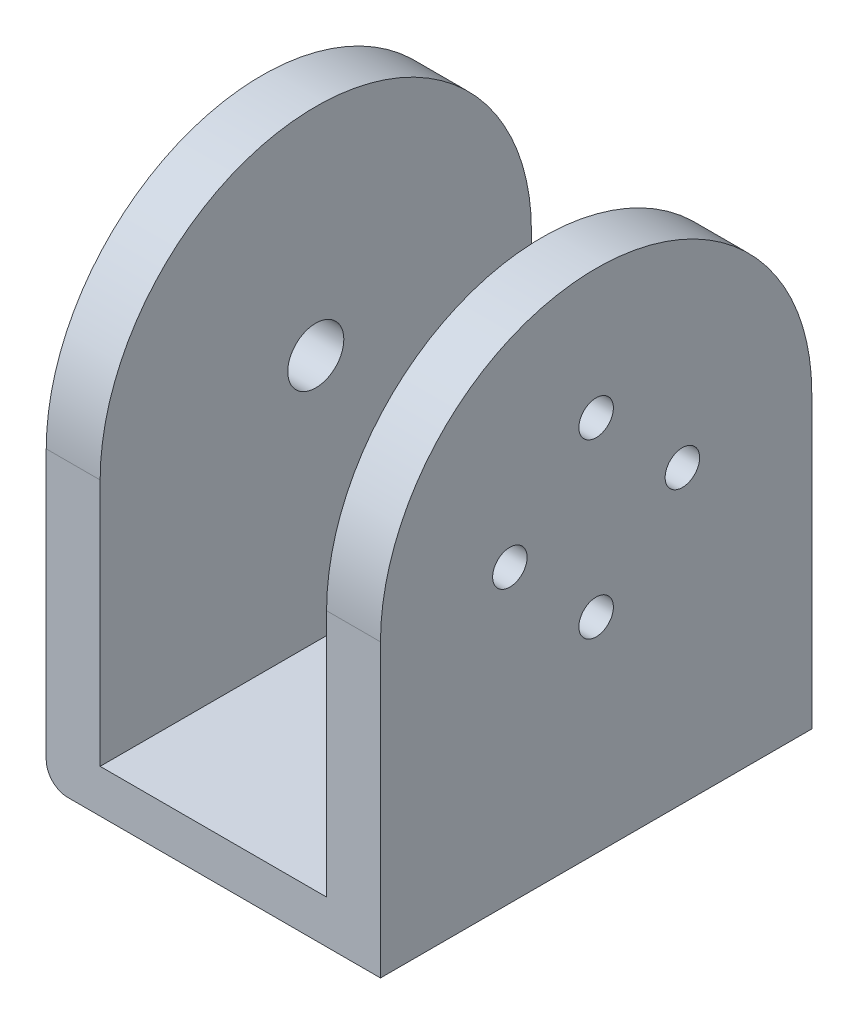
ISO-10303-21;
HEADER;
FILE_DESCRIPTION(('STEP AP214'),'2;1');
FILE_NAME('part.step','',(''),(''),'','','');
FILE_SCHEMA(('AUTOMOTIVE_DESIGN { 1 0 10303 214 1 1 1 1 }'));
ENDSEC;
DATA;
#1=APPLICATION_CONTEXT('core data for automotive mechanical design processes');
#2=APPLICATION_PROTOCOL_DEFINITION('international standard','automotive_design',2000,#1);
#3=PRODUCT_CONTEXT('',#1,'mechanical');
#4=PRODUCT('Part','Part','',(#3));
#5=PRODUCT_RELATED_PRODUCT_CATEGORY('part','',(#4));
#6=PRODUCT_DEFINITION_FORMATION('','',#4);
#7=PRODUCT_DEFINITION_CONTEXT('part definition',#1,'design');
#8=PRODUCT_DEFINITION('design','',#6,#7);
#9=PRODUCT_DEFINITION_SHAPE('','',#8);
#10=(LENGTH_UNIT() NAMED_UNIT(*) SI_UNIT(.MILLI.,.METRE.));
#11=(NAMED_UNIT(*) PLANE_ANGLE_UNIT() SI_UNIT($,.RADIAN.));
#12=(NAMED_UNIT(*) SI_UNIT($,.STERADIAN.) SOLID_ANGLE_UNIT());
#13=UNCERTAINTY_MEASURE_WITH_UNIT(LENGTH_MEASURE(1.E-05),#10,'distance_accuracy_value','');
#14=(GEOMETRIC_REPRESENTATION_CONTEXT(3) GLOBAL_UNCERTAINTY_ASSIGNED_CONTEXT((#13)) GLOBAL_UNIT_ASSIGNED_CONTEXT((#10,
#11,#12)) REPRESENTATION_CONTEXT('',''));
#15=CARTESIAN_POINT('',(0.,0.,0.));
#16=DIRECTION('',(0.,0.,1.));
#17=DIRECTION('',(1.,0.,0.));
#18=AXIS2_PLACEMENT_3D('',#15,#16,#17);
#19=CARTESIAN_POINT('',(3.,27.,0.));
#20=DIRECTION('',(1.,0.,0.));
#21=DIRECTION('',(0.,0.,-1.));
#22=AXIS2_PLACEMENT_3D('',#19,#20,#21);
#23=CYLINDRICAL_SURFACE('',#22,20.);
#24=DIRECTION('',(1.,0.,0.));
#25=VECTOR('',#24,1.);
#26=CARTESIAN_POINT('',(3.,27.,20.));
#27=LINE('',#26,#25);
#28=CARTESIAN_POINT('',(3.,27.,20.));
#29=VERTEX_POINT('',#28);
#30=CARTESIAN_POINT('',(8.00000000000001,27.,20.));
#31=VERTEX_POINT('',#30);
#32=EDGE_CURVE('E177',#29,#31,#27,.T.);
#33=ORIENTED_EDGE('',*,*,#32,.T.);
#34=CARTESIAN_POINT('',(8.,27.,0.));
#35=DIRECTION('',(1.,0.,0.));
#36=DIRECTION('',(0.,0.,-1.));
#37=AXIS2_PLACEMENT_3D('',#34,#35,#36);
#38=CIRCLE('',#37,20.);
#39=CARTESIAN_POINT('',(8.,27.,-20.));
#40=VERTEX_POINT('',#39);
#41=EDGE_CURVE('E137',#40,#31,#38,.T.);
#42=ORIENTED_EDGE('',*,*,#41,.F.);
#43=DIRECTION('',(1.,0.,0.));
#44=VECTOR('',#43,1.);
#45=CARTESIAN_POINT('',(3.,27.,-20.));
#46=LINE('',#45,#44);
#47=CARTESIAN_POINT('',(3.,27.,-20.));
#48=VERTEX_POINT('',#47);
#49=EDGE_CURVE('E167',#48,#40,#46,.T.);
#50=ORIENTED_EDGE('',*,*,#49,.F.);
#51=CARTESIAN_POINT('',(3.,27.,0.));
#52=DIRECTION('',(1.,0.,0.));
#53=DIRECTION('',(0.,0.,-1.));
#54=AXIS2_PLACEMENT_3D('',#51,#52,#53);
#55=CIRCLE('',#54,20.);
#56=EDGE_CURVE('E180',#48,#29,#55,.T.);
#57=ORIENTED_EDGE('',*,*,#56,.T.);
#58=EDGE_LOOP('',(#33,#42,#50,#57));
#59=FACE_BOUND('',#58,.T.);
#60=ADVANCED_FACE('F60',(#59),#23,.T.);
#61=CARTESIAN_POINT('',(-2.,19.,0.));
#62=DIRECTION('',(1.,0.,0.));
#63=DIRECTION('',(0.,0.,-1.));
#64=AXIS2_PLACEMENT_3D('',#61,#62,#63);
#65=CYLINDRICAL_SURFACE('',#64,1.6);
#66=CARTESIAN_POINT('',(3.,19.,0.));
#67=DIRECTION('',(1.,0.,0.));
#68=DIRECTION('',(0.,0.,-1.));
#69=AXIS2_PLACEMENT_3D('',#66,#67,#68);
#70=CIRCLE('',#69,1.6);
#71=CARTESIAN_POINT('',(3.,19.,-1.60000000000008));
#72=VERTEX_POINT('',#71);
#73=EDGE_CURVE('E205',#72,#72,#70,.T.);
#74=ORIENTED_EDGE('',*,*,#73,.F.);
#75=EDGE_LOOP('',(#74));
#76=FACE_BOUND('',#75,.T.);
#77=CARTESIAN_POINT('',(8.,19.,0.));
#78=DIRECTION('',(1.,0.,0.));
#79=DIRECTION('',(0.,0.,-1.));
#80=AXIS2_PLACEMENT_3D('',#77,#78,#79);
#81=CIRCLE('',#80,1.6);
#82=CARTESIAN_POINT('',(8.,19.,-1.60000000000008));
#83=VERTEX_POINT('',#82);
#84=EDGE_CURVE('E221',#83,#83,#81,.F.);
#85=ORIENTED_EDGE('',*,*,#84,.F.);
#86=EDGE_LOOP('',(#85));
#87=FACE_BOUND('',#86,.T.);
#88=ADVANCED_FACE('F259',(#76,#87),#65,.F.);
#89=CARTESIAN_POINT('',(-2.,26.9999999999999,8.));
#90=DIRECTION('',(1.,0.,0.));
#91=DIRECTION('',(0.,0.,-1.));
#92=AXIS2_PLACEMENT_3D('',#89,#90,#91);
#93=CYLINDRICAL_SURFACE('',#92,1.6);
#94=CARTESIAN_POINT('',(3.,26.9999999999999,8.));
#95=DIRECTION('',(1.,0.,0.));
#96=DIRECTION('',(0.,0.,-1.));
#97=AXIS2_PLACEMENT_3D('',#94,#95,#96);
#98=CIRCLE('',#97,1.6);
#99=CARTESIAN_POINT('',(3.,26.9999999999999,6.4));
#100=VERTEX_POINT('',#99);
#101=EDGE_CURVE('E208',#100,#100,#98,.T.);
#102=ORIENTED_EDGE('',*,*,#101,.F.);
#103=EDGE_LOOP('',(#102));
#104=FACE_BOUND('',#103,.T.);
#105=CARTESIAN_POINT('',(8.00000000000001,26.9999999999999,8.));
#106=DIRECTION('',(1.,0.,0.));
#107=DIRECTION('',(0.,0.,-1.));
#108=AXIS2_PLACEMENT_3D('',#105,#106,#107);
#109=CIRCLE('',#108,1.6);
#110=CARTESIAN_POINT('',(8.00000000000001,26.9999999999999,6.4));
#111=VERTEX_POINT('',#110);
#112=EDGE_CURVE('E226',#111,#111,#109,.F.);
#113=ORIENTED_EDGE('',*,*,#112,.F.);
#114=EDGE_LOOP('',(#113));
#115=FACE_BOUND('',#114,.T.);
#116=ADVANCED_FACE('F266',(#104,#115),#93,.F.);
#117=CARTESIAN_POINT('',(-2.,35.,0.));
#118=DIRECTION('',(1.,0.,0.));
#119=DIRECTION('',(0.,0.,-1.));
#120=AXIS2_PLACEMENT_3D('',#117,#118,#119);
#121=CYLINDRICAL_SURFACE('',#120,1.6);
#122=CARTESIAN_POINT('',(3.,35.,0.));
#123=DIRECTION('',(1.,0.,0.));
#124=DIRECTION('',(0.,0.,-1.));
#125=AXIS2_PLACEMENT_3D('',#122,#123,#124);
#126=CIRCLE('',#125,1.6);
#127=CARTESIAN_POINT('',(3.,35.,-1.59999999999997));
#128=VERTEX_POINT('',#127);
#129=EDGE_CURVE('E212',#128,#128,#126,.T.);
#130=ORIENTED_EDGE('',*,*,#129,.F.);
#131=EDGE_LOOP('',(#130));
#132=FACE_BOUND('',#131,.T.);
#133=CARTESIAN_POINT('',(8.,35.,0.));
#134=DIRECTION('',(1.,0.,0.));
#135=DIRECTION('',(0.,0.,-1.));
#136=AXIS2_PLACEMENT_3D('',#133,#134,#135);
#137=CIRCLE('',#136,1.6);
#138=CARTESIAN_POINT('',(8.,35.,-1.59999999999997));
#139=VERTEX_POINT('',#138);
#140=EDGE_CURVE('E445',#139,#139,#137,.F.);
#141=ORIENTED_EDGE('',*,*,#140,.F.);
#142=EDGE_LOOP('',(#141));
#143=FACE_BOUND('',#142,.T.);
#144=ADVANCED_FACE('F284',(#132,#143),#121,.F.);
#145=CARTESIAN_POINT('',(-2.,27.,-8.));
#146=DIRECTION('',(1.,0.,0.));
#147=DIRECTION('',(0.,0.,-1.));
#148=AXIS2_PLACEMENT_3D('',#145,#146,#147);
#149=CYLINDRICAL_SURFACE('',#148,1.6);
#150=CARTESIAN_POINT('',(3.,27.,-8.));
#151=DIRECTION('',(1.,0.,0.));
#152=DIRECTION('',(0.,0.,-1.));
#153=AXIS2_PLACEMENT_3D('',#150,#151,#152);
#154=CIRCLE('',#153,1.6);
#155=CARTESIAN_POINT('',(3.,27.,-9.6));
#156=VERTEX_POINT('',#155);
#157=EDGE_CURVE('E198',#156,#156,#154,.T.);
#158=ORIENTED_EDGE('',*,*,#157,.F.);
#159=EDGE_LOOP('',(#158));
#160=FACE_BOUND('',#159,.T.);
#161=CARTESIAN_POINT('',(8.,27.,-8.));
#162=DIRECTION('',(1.,0.,0.));
#163=DIRECTION('',(0.,0.,-1.));
#164=AXIS2_PLACEMENT_3D('',#161,#162,#163);
#165=CIRCLE('',#164,1.6);
#166=CARTESIAN_POINT('',(8.,27.,-9.6));
#167=VERTEX_POINT('',#166);
#168=EDGE_CURVE('E64',#167,#167,#165,.F.);
#169=ORIENTED_EDGE('',*,*,#168,.F.);
#170=EDGE_LOOP('',(#169));
#171=FACE_BOUND('',#170,.T.);
#172=ADVANCED_FACE('F288',(#160,#171),#149,.F.);
#173=CARTESIAN_POINT('',(-23.,4.,-20.));
#174=DIRECTION('',(1.,0.,0.));
#175=DIRECTION('',(0.,0.,-1.));
#176=AXIS2_PLACEMENT_3D('',#173,#174,#175);
#177=PLANE('',#176);
#178=CARTESIAN_POINT('',(-23.,27.,0.));
#179=DIRECTION('',(-1.,0.,0.));
#180=DIRECTION('',(0.,0.,1.));
#181=AXIS2_PLACEMENT_3D('',#178,#179,#180);
#182=CIRCLE('',#181,2.6);
#183=CARTESIAN_POINT('',(-23.,27.,2.60000000000001));
#184=VERTEX_POINT('',#183);
#185=EDGE_CURVE('E217',#184,#184,#182,.T.);
#186=ORIENTED_EDGE('',*,*,#185,.F.);
#187=EDGE_LOOP('',(#186));
#188=FACE_BOUND('',#187,.T.);
#189=CARTESIAN_POINT('',(-23.,27.,0.));
#190=DIRECTION('',(-1.,0.,0.));
#191=DIRECTION('',(0.,0.,1.));
#192=AXIS2_PLACEMENT_3D('',#189,#190,#191);
#193=CIRCLE('',#192,20.);
#194=CARTESIAN_POINT('',(-23.,27.,20.));
#195=VERTEX_POINT('',#194);
#196=CARTESIAN_POINT('',(-23.,27.,-20.));
#197=VERTEX_POINT('',#196);
#198=EDGE_CURVE('E195',#195,#197,#193,.T.);
#199=ORIENTED_EDGE('',*,*,#198,.T.);
#200=DIRECTION('',(0.,-1.,0.));
#201=VECTOR('',#200,1.);
#202=CARTESIAN_POINT('',(-23.,4.,-20.));
#203=LINE('',#202,#201);
#204=CARTESIAN_POINT('',(-23.,2.,-20.));
#205=VERTEX_POINT('',#204);
#206=EDGE_CURVE('E197',#197,#205,#203,.T.);
#207=ORIENTED_EDGE('',*,*,#206,.T.);
#208=DIRECTION('',(0.,0.,1.));
#209=VECTOR('',#208,1.);
#210=CARTESIAN_POINT('',(-23.,2.,-20.));
#211=LINE('',#210,#209);
#212=CARTESIAN_POINT('',(-23.,2.,20.));
#213=VERTEX_POINT('',#212);
#214=EDGE_CURVE('E200',#205,#213,#211,.T.);
#215=ORIENTED_EDGE('',*,*,#214,.T.);
#216=DIRECTION('',(0.,-1.,0.));
#217=VECTOR('',#216,1.);
#218=CARTESIAN_POINT('',(-23.,4.,20.));
#219=LINE('',#218,#217);
#220=EDGE_CURVE('E159',#195,#213,#219,.T.);
#221=ORIENTED_EDGE('',*,*,#220,.F.);
#222=EDGE_LOOP('',(#199,#207,#215,#221));
#223=FACE_BOUND('',#222,.T.);
#224=ADVANCED_FACE('F62',(#188,#223),#177,.F.);
#225=CARTESIAN_POINT('',(-18.,0.,0.));
#226=DIRECTION('',(1.,0.,0.));
#227=DIRECTION('',(0.,0.,-1.));
#228=AXIS2_PLACEMENT_3D('',#225,#226,#227);
#229=PLANE('',#228);
#230=CARTESIAN_POINT('',(-18.,27.,0.));
#231=DIRECTION('',(1.,0.,0.));
#232=DIRECTION('',(0.,0.,-1.));
#233=AXIS2_PLACEMENT_3D('',#230,#231,#232);
#234=CIRCLE('',#233,2.6);
#235=CARTESIAN_POINT('',(-18.,27.,-2.6));
#236=VERTEX_POINT('',#235);
#237=EDGE_CURVE('E209',#236,#236,#234,.T.);
#238=ORIENTED_EDGE('',*,*,#237,.F.);
#239=EDGE_LOOP('',(#238));
#240=FACE_BOUND('',#239,.T.);
#241=CARTESIAN_POINT('',(-18.,27.,0.));
#242=DIRECTION('',(1.,0.,0.));
#243=DIRECTION('',(0.,0.,-1.));
#244=AXIS2_PLACEMENT_3D('',#241,#242,#243);
#245=CIRCLE('',#244,20.);
#246=CARTESIAN_POINT('',(-18.,27.,-20.));
#247=VERTEX_POINT('',#246);
#248=CARTESIAN_POINT('',(-18.,27.,20.));
#249=VERTEX_POINT('',#248);
#250=EDGE_CURVE('E77',#247,#249,#245,.T.);
#251=ORIENTED_EDGE('',*,*,#250,.T.);
#252=DIRECTION('',(0.,1.,0.));
#253=VECTOR('',#252,1.);
#254=CARTESIAN_POINT('',(-18.,4.,20.));
#255=LINE('',#254,#253);
#256=CARTESIAN_POINT('',(-18.,4.,20.));
#257=VERTEX_POINT('',#256);
#258=EDGE_CURVE('E172',#257,#249,#255,.T.);
#259=ORIENTED_EDGE('',*,*,#258,.F.);
#260=DIRECTION('',(0.,0.,-1.));
#261=VECTOR('',#260,1.);
#262=CARTESIAN_POINT('',(-18.,4.,20.));
#263=LINE('',#262,#261);
#264=CARTESIAN_POINT('',(-18.,4.,-20.));
#265=VERTEX_POINT('',#264);
#266=EDGE_CURVE('E173',#257,#265,#263,.T.);
#267=ORIENTED_EDGE('',*,*,#266,.T.);
#268=DIRECTION('',(0.,1.,0.));
#269=VECTOR('',#268,1.);
#270=CARTESIAN_POINT('',(-18.,4.,-20.));
#271=LINE('',#270,#269);
#272=EDGE_CURVE('E176',#265,#247,#271,.T.);
#273=ORIENTED_EDGE('',*,*,#272,.T.);
#274=EDGE_LOOP('',(#251,#259,#267,#273));
#275=FACE_BOUND('',#274,.T.);
#276=ADVANCED_FACE('F411',(#240,#275),#229,.T.);
#277=CARTESIAN_POINT('',(-23.,4.,-20.));
#278=DIRECTION('',(0.,0.,1.));
#279=DIRECTION('',(1.,0.,0.));
#280=AXIS2_PLACEMENT_3D('',#277,#278,#279);
#281=PLANE('',#280);
#282=DIRECTION('',(0.,1.,0.));
#283=VECTOR('',#282,1.);
#284=CARTESIAN_POINT('',(8.,2.,-20.));
#285=LINE('',#284,#283);
#286=CARTESIAN_POINT('',(8.,0.,-20.));
#287=VERTEX_POINT('',#286);
#288=EDGE_CURVE('E141',#287,#40,#285,.T.);
#289=ORIENTED_EDGE('',*,*,#288,.F.);
#290=DIRECTION('',(-1.,0.,0.));
#291=VECTOR('',#290,1.);
#292=CARTESIAN_POINT('',(-23.,0.,-20.));
#293=LINE('',#292,#291);
#294=CARTESIAN_POINT('',(-21.,0.,-20.));
#295=VERTEX_POINT('',#294);
#296=EDGE_CURVE('E149',#287,#295,#293,.T.);
#297=ORIENTED_EDGE('',*,*,#296,.T.);
#298=CARTESIAN_POINT('',(-21.,2.,-20.));
#299=DIRECTION('',(0.,0.,1.));
#300=DIRECTION('',(1.,0.,0.));
#301=AXIS2_PLACEMENT_3D('',#298,#299,#300);
#302=CIRCLE('',#301,2.);
#303=EDGE_CURVE('E166',#295,#205,#302,.F.);
#304=ORIENTED_EDGE('',*,*,#303,.T.);
#305=ORIENTED_EDGE('',*,*,#206,.F.);
#306=DIRECTION('',(-1.,0.,0.));
#307=VECTOR('',#306,1.);
#308=CARTESIAN_POINT('',(-13.,27.,-20.));
#309=LINE('',#308,#307);
#310=EDGE_CURVE('E12',#247,#197,#309,.T.);
#311=ORIENTED_EDGE('',*,*,#310,.F.);
#312=ORIENTED_EDGE('',*,*,#272,.F.);
#313=DIRECTION('',(-1.,0.,0.));
#314=VECTOR('',#313,1.);
#315=CARTESIAN_POINT('',(-23.,4.,-20.));
#316=LINE('',#315,#314);
#317=CARTESIAN_POINT('',(3.,4.,-20.));
#318=VERTEX_POINT('',#317);
#319=EDGE_CURVE('E170',#318,#265,#316,.T.);
#320=ORIENTED_EDGE('',*,*,#319,.F.);
#321=DIRECTION('',(0.,1.,0.));
#322=VECTOR('',#321,1.);
#323=CARTESIAN_POINT('',(3.,27.,-20.));
#324=LINE('',#323,#322);
#325=EDGE_CURVE('E183',#318,#48,#324,.T.);
#326=ORIENTED_EDGE('',*,*,#325,.T.);
#327=ORIENTED_EDGE('',*,*,#49,.T.);
#328=EDGE_LOOP('',(#289,#297,#304,#305,#311,#312,#320,#326,#327));
#329=FACE_BOUND('',#328,.T.);
#330=ADVANCED_FACE('F273',(#329),#281,.F.);
#331=CARTESIAN_POINT('',(0.,4.,0.));
#332=DIRECTION('',(0.,1.,0.));
#333=DIRECTION('',(0.,0.,1.));
#334=AXIS2_PLACEMENT_3D('',#331,#332,#333);
#335=PLANE('',#334);
#336=CARTESIAN_POINT('',(-4.99,4.,4.98));
#337=DIRECTION('',(0.,1.,0.));
#338=DIRECTION('',(0.,0.,1.));
#339=AXIS2_PLACEMENT_3D('',#336,#337,#338);
#340=CIRCLE('',#339,1.55);
#341=CARTESIAN_POINT('',(-4.99,4.,6.53));
#342=VERTEX_POINT('',#341);
#343=EDGE_CURVE('E70',#342,#342,#340,.T.);
#344=ORIENTED_EDGE('',*,*,#343,.F.);
#345=EDGE_LOOP('',(#344));
#346=FACE_BOUND('',#345,.T.);
#347=CARTESIAN_POINT('',(-4.99,4.,-4.99));
#348=DIRECTION('',(0.,1.,0.));
#349=DIRECTION('',(0.,0.,1.));
#350=AXIS2_PLACEMENT_3D('',#347,#348,#349);
#351=CIRCLE('',#350,1.55);
#352=CARTESIAN_POINT('',(-4.99,4.,-3.44));
#353=VERTEX_POINT('',#352);
#354=EDGE_CURVE('E179',#353,#353,#351,.T.);
#355=ORIENTED_EDGE('',*,*,#354,.F.);
#356=EDGE_LOOP('',(#355));
#357=FACE_BOUND('',#356,.T.);
#358=DIRECTION('',(1.,0.,0.));
#359=VECTOR('',#358,1.);
#360=CARTESIAN_POINT('',(-23.,4.,20.));
#361=LINE('',#360,#359);
#362=CARTESIAN_POINT('',(3.,4.,20.));
#363=VERTEX_POINT('',#362);
#364=EDGE_CURVE('E168',#257,#363,#361,.T.);
#365=ORIENTED_EDGE('',*,*,#364,.T.);
#366=DIRECTION('',(0.,0.,-1.));
#367=VECTOR('',#366,1.);
#368=CARTESIAN_POINT('',(3.,4.,0.));
#369=LINE('',#368,#367);
#370=EDGE_CURVE('E163',#363,#318,#369,.T.);
#371=ORIENTED_EDGE('',*,*,#370,.T.);
#372=ORIENTED_EDGE('',*,*,#319,.T.);
#373=ORIENTED_EDGE('',*,*,#266,.F.);
#374=EDGE_LOOP('',(#365,#371,#372,#373));
#375=FACE_BOUND('',#374,.T.);
#376=ADVANCED_FACE('F270',(#346,#357,#375),#335,.T.);
#377=CARTESIAN_POINT('',(-23.,4.,20.));
#378=DIRECTION('',(0.,0.,-1.));
#379=DIRECTION('',(-1.,0.,0.));
#380=AXIS2_PLACEMENT_3D('',#377,#378,#379);
#381=PLANE('',#380);
#382=DIRECTION('',(1.,0.,0.));
#383=VECTOR('',#382,1.);
#384=CARTESIAN_POINT('',(-23.,0.,20.));
#385=LINE('',#384,#383);
#386=CARTESIAN_POINT('',(-21.,0.,20.));
#387=VERTEX_POINT('',#386);
#388=CARTESIAN_POINT('',(8.,0.,20.));
#389=VERTEX_POINT('',#388);
#390=EDGE_CURVE('E147',#387,#389,#385,.T.);
#391=ORIENTED_EDGE('',*,*,#390,.T.);
#392=DIRECTION('',(0.,-1.,0.));
#393=VECTOR('',#392,1.);
#394=CARTESIAN_POINT('',(8.00000000000001,27.,20.));
#395=LINE('',#394,#393);
#396=EDGE_CURVE('E130',#31,#389,#395,.T.);
#397=ORIENTED_EDGE('',*,*,#396,.F.);
#398=ORIENTED_EDGE('',*,*,#32,.F.);
#399=DIRECTION('',(0.,-1.,0.));
#400=VECTOR('',#399,1.);
#401=CARTESIAN_POINT('',(3.,27.,20.));
#402=LINE('',#401,#400);
#403=EDGE_CURVE('E154',#29,#363,#402,.T.);
#404=ORIENTED_EDGE('',*,*,#403,.T.);
#405=ORIENTED_EDGE('',*,*,#364,.F.);
#406=ORIENTED_EDGE('',*,*,#258,.T.);
#407=DIRECTION('',(-1.,0.,0.));
#408=VECTOR('',#407,1.);
#409=CARTESIAN_POINT('',(-13.,27.,20.));
#410=LINE('',#409,#408);
#411=EDGE_CURVE('E192',#249,#195,#410,.T.);
#412=ORIENTED_EDGE('',*,*,#411,.T.);
#413=ORIENTED_EDGE('',*,*,#220,.T.);
#414=CARTESIAN_POINT('',(-21.,2.,20.));
#415=DIRECTION('',(0.,0.,-1.));
#416=DIRECTION('',(-1.,0.,0.));
#417=AXIS2_PLACEMENT_3D('',#414,#415,#416);
#418=CIRCLE('',#417,2.);
#419=EDGE_CURVE('E153',#213,#387,#418,.F.);
#420=ORIENTED_EDGE('',*,*,#419,.T.);
#421=EDGE_LOOP('',(#391,#397,#398,#404,#405,#406,#412,#413,#420));
#422=FACE_BOUND('',#421,.T.);
#423=ADVANCED_FACE('F151',(#422),#381,.F.);
#424=CARTESIAN_POINT('',(0.,0.,0.));
#425=DIRECTION('',(0.,1.,0.));
#426=DIRECTION('',(0.,0.,1.));
#427=AXIS2_PLACEMENT_3D('',#424,#425,#426);
#428=PLANE('',#427);
#429=CARTESIAN_POINT('',(-4.99,0.,4.98));
#430=DIRECTION('',(0.,1.,0.));
#431=DIRECTION('',(0.,0.,1.));
#432=AXIS2_PLACEMENT_3D('',#429,#430,#431);
#433=CIRCLE('',#432,1.55);
#434=CARTESIAN_POINT('',(-4.99,0.,6.53));
#435=VERTEX_POINT('',#434);
#436=EDGE_CURVE('E157',#435,#435,#433,.T.);
#437=ORIENTED_EDGE('',*,*,#436,.T.);
#438=EDGE_LOOP('',(#437));
#439=FACE_BOUND('',#438,.T.);
#440=CARTESIAN_POINT('',(-4.99,0.,-4.99));
#441=DIRECTION('',(0.,1.,0.));
#442=DIRECTION('',(0.,0.,1.));
#443=AXIS2_PLACEMENT_3D('',#440,#441,#442);
#444=CIRCLE('',#443,1.55);
#445=CARTESIAN_POINT('',(-4.99,0.,-3.44));
#446=VERTEX_POINT('',#445);
#447=EDGE_CURVE('E233',#446,#446,#444,.T.);
#448=ORIENTED_EDGE('',*,*,#447,.T.);
#449=EDGE_LOOP('',(#448));
#450=FACE_BOUND('',#449,.T.);
#451=ORIENTED_EDGE('',*,*,#296,.F.);
#452=DIRECTION('',(0.,0.,1.));
#453=VECTOR('',#452,1.);
#454=CARTESIAN_POINT('',(8.,0.,0.));
#455=LINE('',#454,#453);
#456=EDGE_CURVE('E134',#287,#389,#455,.T.);
#457=ORIENTED_EDGE('',*,*,#456,.T.);
#458=ORIENTED_EDGE('',*,*,#390,.F.);
#459=DIRECTION('',(0.,0.,1.));
#460=VECTOR('',#459,1.);
#461=CARTESIAN_POINT('',(-21.,0.,0.));
#462=LINE('',#461,#460);
#463=EDGE_CURVE('E187',#387,#295,#462,.F.);
#464=ORIENTED_EDGE('',*,*,#463,.T.);
#465=EDGE_LOOP('',(#451,#457,#458,#464));
#466=FACE_BOUND('',#465,.T.);
#467=ADVANCED_FACE('F145',(#439,#450,#466),#428,.F.);
#468=CARTESIAN_POINT('',(3.,27.,0.));
#469=DIRECTION('',(1.,0.,0.));
#470=DIRECTION('',(0.,0.,-1.));
#471=AXIS2_PLACEMENT_3D('',#468,#469,#470);
#472=PLANE('',#471);
#473=ORIENTED_EDGE('',*,*,#157,.T.);
#474=EDGE_LOOP('',(#473));
#475=FACE_BOUND('',#474,.T.);
#476=ORIENTED_EDGE('',*,*,#129,.T.);
#477=EDGE_LOOP('',(#476));
#478=FACE_BOUND('',#477,.T.);
#479=ORIENTED_EDGE('',*,*,#101,.T.);
#480=EDGE_LOOP('',(#479));
#481=FACE_BOUND('',#480,.T.);
#482=ORIENTED_EDGE('',*,*,#73,.T.);
#483=EDGE_LOOP('',(#482));
#484=FACE_BOUND('',#483,.T.);
#485=ORIENTED_EDGE('',*,*,#370,.F.);
#486=ORIENTED_EDGE('',*,*,#403,.F.);
#487=ORIENTED_EDGE('',*,*,#56,.F.);
#488=ORIENTED_EDGE('',*,*,#325,.F.);
#489=EDGE_LOOP('',(#485,#486,#487,#488));
#490=FACE_BOUND('',#489,.T.);
#491=ADVANCED_FACE('F245',(#475,#478,#481,#484,#490),#472,.F.);
#492=CARTESIAN_POINT('',(-4.99,-5.,-4.99));
#493=DIRECTION('',(0.,1.,0.));
#494=DIRECTION('',(0.,0.,1.));
#495=AXIS2_PLACEMENT_3D('',#492,#493,#494);
#496=CYLINDRICAL_SURFACE('',#495,1.55);
#497=ORIENTED_EDGE('',*,*,#354,.T.);
#498=EDGE_LOOP('',(#497));
#499=FACE_BOUND('',#498,.T.);
#500=ORIENTED_EDGE('',*,*,#447,.F.);
#501=EDGE_LOOP('',(#500));
#502=FACE_BOUND('',#501,.T.);
#503=ADVANCED_FACE('F242',(#499,#502),#496,.F.);
#504=CARTESIAN_POINT('',(-4.99,-5.,4.98));
#505=DIRECTION('',(0.,1.,0.));
#506=DIRECTION('',(0.,0.,1.));
#507=AXIS2_PLACEMENT_3D('',#504,#505,#506);
#508=CYLINDRICAL_SURFACE('',#507,1.55);
#509=ORIENTED_EDGE('',*,*,#343,.T.);
#510=EDGE_LOOP('',(#509));
#511=FACE_BOUND('',#510,.T.);
#512=ORIENTED_EDGE('',*,*,#436,.F.);
#513=EDGE_LOOP('',(#512));
#514=FACE_BOUND('',#513,.T.);
#515=ADVANCED_FACE('F244',(#511,#514),#508,.F.);
#516=CARTESIAN_POINT('',(-21.,2.,-20.));
#517=DIRECTION('',(0.,0.,1.));
#518=DIRECTION('',(1.,0.,0.));
#519=AXIS2_PLACEMENT_3D('',#516,#517,#518);
#520=CYLINDRICAL_SURFACE('',#519,2.);
#521=ORIENTED_EDGE('',*,*,#303,.F.);
#522=ORIENTED_EDGE('',*,*,#463,.F.);
#523=ORIENTED_EDGE('',*,*,#419,.F.);
#524=ORIENTED_EDGE('',*,*,#214,.F.);
#525=EDGE_LOOP('',(#521,#522,#523,#524));
#526=FACE_BOUND('',#525,.T.);
#527=ADVANCED_FACE('F251',(#526),#520,.T.);
#528=CARTESIAN_POINT('',(-13.,27.,0.));
#529=DIRECTION('',(-1.,0.,0.));
#530=DIRECTION('',(0.,0.,1.));
#531=AXIS2_PLACEMENT_3D('',#528,#529,#530);
#532=CYLINDRICAL_SURFACE('',#531,20.);
#533=ORIENTED_EDGE('',*,*,#310,.T.);
#534=ORIENTED_EDGE('',*,*,#198,.F.);
#535=ORIENTED_EDGE('',*,*,#411,.F.);
#536=ORIENTED_EDGE('',*,*,#250,.F.);
#537=EDGE_LOOP('',(#533,#534,#535,#536));
#538=FACE_BOUND('',#537,.T.);
#539=ADVANCED_FACE('F279',(#538),#532,.T.);
#540=CARTESIAN_POINT('',(-13.,27.,0.));
#541=DIRECTION('',(-1.,0.,0.));
#542=DIRECTION('',(0.,0.,1.));
#543=AXIS2_PLACEMENT_3D('',#540,#541,#542);
#544=CYLINDRICAL_SURFACE('',#543,2.6);
#545=ORIENTED_EDGE('',*,*,#237,.T.);
#546=EDGE_LOOP('',(#545));
#547=FACE_BOUND('',#546,.T.);
#548=ORIENTED_EDGE('',*,*,#185,.T.);
#549=EDGE_LOOP('',(#548));
#550=FACE_BOUND('',#549,.T.);
#551=ADVANCED_FACE('F293',(#547,#550),#544,.F.);
#552=CARTESIAN_POINT('',(8.,27.,0.));
#553=DIRECTION('',(1.,0.,0.));
#554=DIRECTION('',(0.,0.,-1.));
#555=AXIS2_PLACEMENT_3D('',#552,#553,#554);
#556=PLANE('',#555);
#557=ORIENTED_EDGE('',*,*,#41,.T.);
#558=ORIENTED_EDGE('',*,*,#396,.T.);
#559=ORIENTED_EDGE('',*,*,#456,.F.);
#560=ORIENTED_EDGE('',*,*,#288,.T.);
#561=EDGE_LOOP('',(#557,#558,#559,#560));
#562=FACE_BOUND('',#561,.T.);
#563=ORIENTED_EDGE('',*,*,#168,.T.);
#564=EDGE_LOOP('',(#563));
#565=FACE_BOUND('',#564,.T.);
#566=ORIENTED_EDGE('',*,*,#140,.T.);
#567=EDGE_LOOP('',(#566));
#568=FACE_BOUND('',#567,.T.);
#569=ORIENTED_EDGE('',*,*,#112,.T.);
#570=EDGE_LOOP('',(#569));
#571=FACE_BOUND('',#570,.T.);
#572=ORIENTED_EDGE('',*,*,#84,.T.);
#573=EDGE_LOOP('',(#572));
#574=FACE_BOUND('',#573,.T.);
#575=ADVANCED_FACE('F132',(#562,#565,#568,#571,#574),#556,.T.);
#576=CLOSED_SHELL('',(#60,#88,#116,#144,#172,#224,#276,#330,#376,#423,#467,#491,#503,#515,#527,
#539,#551,#575));
#577=MANIFOLD_SOLID_BREP('B2',#576);
#578=ADVANCED_BREP_SHAPE_REPRESENTATION('',(#18,#577),#14);
#579=SHAPE_DEFINITION_REPRESENTATION(#9,#578);
ENDSEC;
END-ISO-10303-21;
